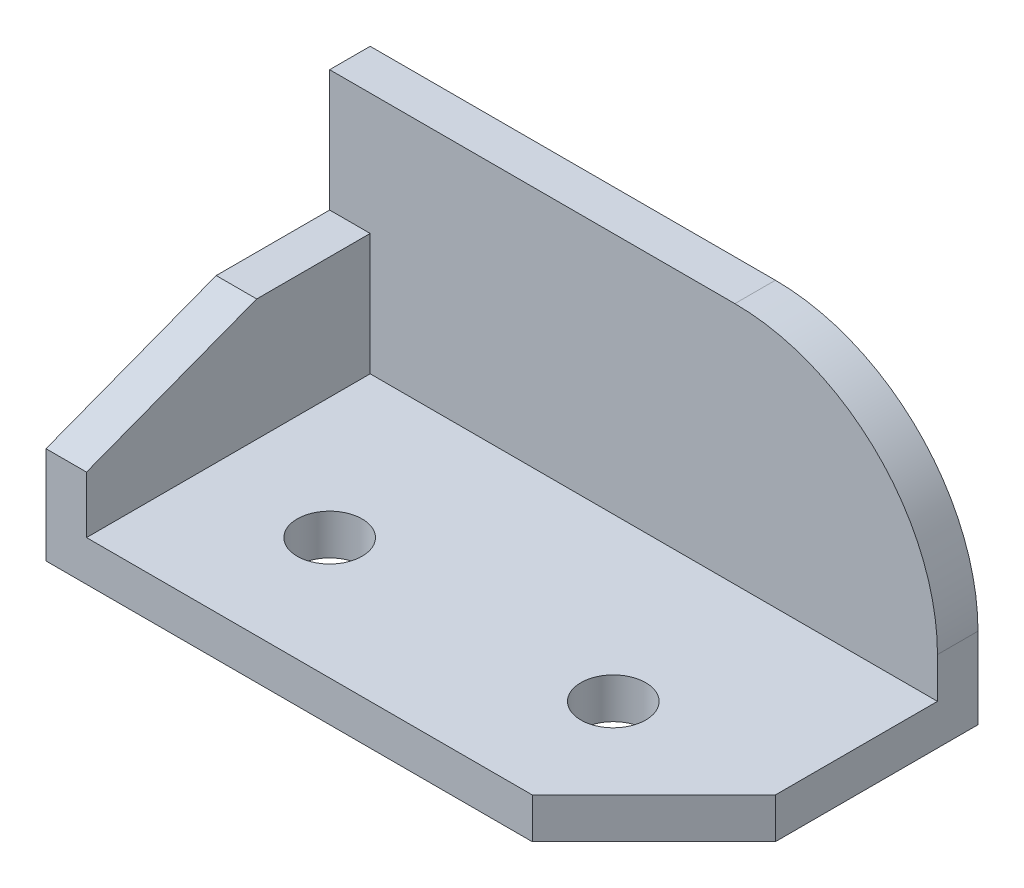
ISO-10303-21;
HEADER;
FILE_DESCRIPTION(('STEP AP214'),'2;1');
FILE_NAME('part.step','',(''),(''),'','','');
FILE_SCHEMA(('AUTOMOTIVE_DESIGN { 1 0 10303 214 1 1 1 1 }'));
ENDSEC;
DATA;
#1=APPLICATION_CONTEXT('core data for automotive mechanical design processes');
#2=APPLICATION_PROTOCOL_DEFINITION('international standard','automotive_design',2000,#1);
#3=PRODUCT_CONTEXT('',#1,'mechanical');
#4=PRODUCT('Part','Part','',(#3));
#5=PRODUCT_RELATED_PRODUCT_CATEGORY('part','',(#4));
#6=PRODUCT_DEFINITION_FORMATION('','',#4);
#7=PRODUCT_DEFINITION_CONTEXT('part definition',#1,'design');
#8=PRODUCT_DEFINITION('design','',#6,#7);
#9=PRODUCT_DEFINITION_SHAPE('','',#8);
#10=(LENGTH_UNIT() NAMED_UNIT(*) SI_UNIT(.MILLI.,.METRE.));
#11=(NAMED_UNIT(*) PLANE_ANGLE_UNIT() SI_UNIT($,.RADIAN.));
#12=(NAMED_UNIT(*) SI_UNIT($,.STERADIAN.) SOLID_ANGLE_UNIT());
#13=UNCERTAINTY_MEASURE_WITH_UNIT(LENGTH_MEASURE(1.E-05),#10,'distance_accuracy_value','');
#14=(GEOMETRIC_REPRESENTATION_CONTEXT(3) GLOBAL_UNCERTAINTY_ASSIGNED_CONTEXT((#13)) GLOBAL_UNIT_ASSIGNED_CONTEXT((#10,
#11,#12)) REPRESENTATION_CONTEXT('',''));
#15=CARTESIAN_POINT('',(0.,0.,0.));
#16=DIRECTION('',(0.,0.,1.));
#17=DIRECTION('',(1.,0.,0.));
#18=AXIS2_PLACEMENT_3D('',#15,#16,#17);
#19=CARTESIAN_POINT('',(5.,20.,0.));
#20=DIRECTION('',(0.,1.,0.));
#21=DIRECTION('',(0.,0.,1.));
#22=AXIS2_PLACEMENT_3D('',#19,#20,#21);
#23=PLANE('',#22);
#24=DIRECTION('',(0.,0.,-1.));
#25=VECTOR('',#24,1.);
#26=CARTESIAN_POINT('',(5.,20.,0.));
#27=LINE('',#26,#25);
#28=CARTESIAN_POINT('',(5.,20.,19.));
#29=VERTEX_POINT('',#28);
#30=CARTESIAN_POINT('',(5.,20.,5.));
#31=VERTEX_POINT('',#30);
#32=EDGE_CURVE('E172',#29,#31,#27,.T.);
#33=ORIENTED_EDGE('',*,*,#32,.T.);
#34=DIRECTION('',(1.,0.,0.));
#35=VECTOR('',#34,1.);
#36=CARTESIAN_POINT('',(0.,20.,5.));
#37=LINE('',#36,#35);
#38=CARTESIAN_POINT('',(0.,20.,5.));
#39=VERTEX_POINT('',#38);
#40=EDGE_CURVE('E59',#39,#31,#37,.T.);
#41=ORIENTED_EDGE('',*,*,#40,.F.);
#42=DIRECTION('',(0.,0.,-1.));
#43=VECTOR('',#42,1.);
#44=CARTESIAN_POINT('',(0.,20.,0.));
#45=LINE('',#44,#43);
#46=CARTESIAN_POINT('',(0.,20.,19.));
#47=VERTEX_POINT('',#46);
#48=EDGE_CURVE('E169',#47,#39,#45,.T.);
#49=ORIENTED_EDGE('',*,*,#48,.F.);
#50=DIRECTION('',(-1.,0.,0.));
#51=VECTOR('',#50,1.);
#52=CARTESIAN_POINT('',(5.,20.,19.));
#53=LINE('',#52,#51);
#54=EDGE_CURVE('E180',#29,#47,#53,.T.);
#55=ORIENTED_EDGE('',*,*,#54,.F.);
#56=EDGE_LOOP('',(#33,#41,#49,#55));
#57=FACE_BOUND('',#56,.T.);
#58=ADVANCED_FACE('F43',(#57),#23,.T.);
#59=CARTESIAN_POINT('',(5.,0.,0.));
#60=DIRECTION('',(1.,0.,0.));
#61=DIRECTION('',(0.,0.,-1.));
#62=AXIS2_PLACEMENT_3D('',#59,#60,#61);
#63=PLANE('',#62);
#64=DIRECTION('',(0.,0.,-1.));
#65=VECTOR('',#64,1.);
#66=CARTESIAN_POINT('',(5.,5.,0.));
#67=LINE('',#66,#65);
#68=CARTESIAN_POINT('',(5.,5.,40.));
#69=VERTEX_POINT('',#68);
#70=CARTESIAN_POINT('',(5.,5.,5.));
#71=VERTEX_POINT('',#70);
#72=EDGE_CURVE('E11',#69,#71,#67,.T.);
#73=ORIENTED_EDGE('',*,*,#72,.T.);
#74=DIRECTION('',(0.,-1.,0.));
#75=VECTOR('',#74,1.);
#76=CARTESIAN_POINT('',(5.,0.,5.));
#77=LINE('',#76,#75);
#78=EDGE_CURVE('E160',#31,#71,#77,.T.);
#79=ORIENTED_EDGE('',*,*,#78,.F.);
#80=ORIENTED_EDGE('',*,*,#32,.F.);
#81=DIRECTION('',(0.,0.355995327591988,-0.934487734928968));
#82=VECTOR('',#81,1.);
#83=CARTESIAN_POINT('',(5.,20.,19.));
#84=LINE('',#83,#82);
#85=CARTESIAN_POINT('',(5.00000000000001,12.,40.));
#86=VERTEX_POINT('',#85);
#87=EDGE_CURVE('E170',#86,#29,#84,.T.);
#88=ORIENTED_EDGE('',*,*,#87,.F.);
#89=DIRECTION('',(0.,1.,0.));
#90=VECTOR('',#89,1.);
#91=CARTESIAN_POINT('',(5.00000000000001,0.,40.));
#92=LINE('',#91,#90);
#93=EDGE_CURVE('E164',#69,#86,#92,.T.);
#94=ORIENTED_EDGE('',*,*,#93,.F.);
#95=EDGE_LOOP('',(#73,#79,#80,#88,#94));
#96=FACE_BOUND('',#95,.T.);
#97=ADVANCED_FACE('F258',(#96),#63,.T.);
#98=CARTESIAN_POINT('',(50.,5.,50.));
#99=DIRECTION('',(0.707106781186548,0.,0.707106781186548));
#100=DIRECTION('',(0.707106781186548,0.,-0.707106781186548));
#101=AXIS2_PLACEMENT_3D('',#98,#99,#100);
#102=PLANE('',#101);
#103=DIRECTION('',(-0.707106781186548,0.,0.707106781186548));
#104=VECTOR('',#103,1.);
#105=CARTESIAN_POINT('',(50.,0.,50.));
#106=LINE('',#105,#104);
#107=CARTESIAN_POINT('',(75.,0.,25.));
#108=VERTEX_POINT('',#107);
#109=CARTESIAN_POINT('',(60.,0.,40.));
#110=VERTEX_POINT('',#109);
#111=EDGE_CURVE('E204',#108,#110,#106,.T.);
#112=ORIENTED_EDGE('',*,*,#111,.F.);
#113=DIRECTION('',(0.,-1.,0.));
#114=VECTOR('',#113,1.);
#115=CARTESIAN_POINT('',(75.,5.,25.));
#116=LINE('',#115,#114);
#117=CARTESIAN_POINT('',(75.,5.,25.));
#118=VERTEX_POINT('',#117);
#119=EDGE_CURVE('E51',#118,#108,#116,.T.);
#120=ORIENTED_EDGE('',*,*,#119,.F.);
#121=DIRECTION('',(-0.707106781186548,0.,0.707106781186548));
#122=VECTOR('',#121,1.);
#123=CARTESIAN_POINT('',(50.,5.,50.));
#124=LINE('',#123,#122);
#125=CARTESIAN_POINT('',(60.,5.,40.));
#126=VERTEX_POINT('',#125);
#127=EDGE_CURVE('E193',#118,#126,#124,.T.);
#128=ORIENTED_EDGE('',*,*,#127,.T.);
#129=DIRECTION('',(0.,-1.,0.));
#130=VECTOR('',#129,1.);
#131=CARTESIAN_POINT('',(60.,5.,40.));
#132=LINE('',#131,#130);
#133=EDGE_CURVE('E196',#126,#110,#132,.T.);
#134=ORIENTED_EDGE('',*,*,#133,.T.);
#135=EDGE_LOOP('',(#112,#120,#128,#134));
#136=FACE_BOUND('',#135,.T.);
#137=ADVANCED_FACE('F232',(#136),#102,.T.);
#138=CARTESIAN_POINT('',(75.,5.,0.));
#139=DIRECTION('',(1.,0.,0.));
#140=DIRECTION('',(0.,0.,-1.));
#141=AXIS2_PLACEMENT_3D('',#138,#139,#140);
#142=PLANE('',#141);
#143=DIRECTION('',(0.,0.,1.));
#144=VECTOR('',#143,1.);
#145=CARTESIAN_POINT('',(75.,0.,0.));
#146=LINE('',#145,#144);
#147=CARTESIAN_POINT('',(75.,0.,0.));
#148=VERTEX_POINT('',#147);
#149=EDGE_CURVE('E210',#148,#108,#146,.T.);
#150=ORIENTED_EDGE('',*,*,#149,.F.);
#151=DIRECTION('',(0.,-1.,0.));
#152=VECTOR('',#151,1.);
#153=CARTESIAN_POINT('',(75.,5.,0.));
#154=LINE('',#153,#152);
#155=CARTESIAN_POINT('',(75.,9.99999999999999,0.));
#156=VERTEX_POINT('',#155);
#157=EDGE_CURVE('E224',#156,#148,#154,.T.);
#158=ORIENTED_EDGE('',*,*,#157,.F.);
#159=DIRECTION('',(0.,0.,-1.));
#160=VECTOR('',#159,1.);
#161=CARTESIAN_POINT('',(75.,9.99999999999999,5.));
#162=LINE('',#161,#160);
#163=CARTESIAN_POINT('',(75.,9.99999999999999,5.));
#164=VERTEX_POINT('',#163);
#165=EDGE_CURVE('E138',#164,#156,#162,.T.);
#166=ORIENTED_EDGE('',*,*,#165,.F.);
#167=DIRECTION('',(0.,-1.,0.));
#168=VECTOR('',#167,1.);
#169=CARTESIAN_POINT('',(75.,0.,5.));
#170=LINE('',#169,#168);
#171=CARTESIAN_POINT('',(75.,5.,5.));
#172=VERTEX_POINT('',#171);
#173=EDGE_CURVE('E144',#164,#172,#170,.T.);
#174=ORIENTED_EDGE('',*,*,#173,.T.);
#175=DIRECTION('',(0.,0.,1.));
#176=VECTOR('',#175,1.);
#177=CARTESIAN_POINT('',(75.,5.,0.));
#178=LINE('',#177,#176);
#179=EDGE_CURVE('E195',#172,#118,#178,.T.);
#180=ORIENTED_EDGE('',*,*,#179,.T.);
#181=ORIENTED_EDGE('',*,*,#119,.T.);
#182=EDGE_LOOP('',(#150,#158,#166,#174,#180,#181));
#183=FACE_BOUND('',#182,.T.);
#184=ADVANCED_FACE('F226',(#183),#142,.T.);
#185=CARTESIAN_POINT('',(0.,5.,0.));
#186=DIRECTION('',(0.,0.,-1.));
#187=DIRECTION('',(-1.,0.,0.));
#188=AXIS2_PLACEMENT_3D('',#185,#186,#187);
#189=PLANE('',#188);
#190=DIRECTION('',(0.,-1.,0.));
#191=VECTOR('',#190,1.);
#192=CARTESIAN_POINT('',(0.,5.,0.));
#193=LINE('',#192,#191);
#194=CARTESIAN_POINT('',(0.,35.,0.));
#195=VERTEX_POINT('',#194);
#196=CARTESIAN_POINT('',(0.,0.,0.));
#197=VERTEX_POINT('',#196);
#198=EDGE_CURVE('E222',#195,#197,#193,.T.);
#199=ORIENTED_EDGE('',*,*,#198,.F.);
#200=DIRECTION('',(1.,0.,0.));
#201=VECTOR('',#200,1.);
#202=CARTESIAN_POINT('',(0.,35.,0.));
#203=LINE('',#202,#201);
#204=CARTESIAN_POINT('',(50.,35.,0.));
#205=VERTEX_POINT('',#204);
#206=EDGE_CURVE('E151',#195,#205,#203,.T.);
#207=ORIENTED_EDGE('',*,*,#206,.T.);
#208=CARTESIAN_POINT('',(50.,9.99999999999999,0.));
#209=DIRECTION('',(0.,0.,-1.));
#210=DIRECTION('',(-1.,0.,0.));
#211=AXIS2_PLACEMENT_3D('',#208,#209,#210);
#212=CIRCLE('',#211,25.);
#213=EDGE_CURVE('E132',#205,#156,#212,.T.);
#214=ORIENTED_EDGE('',*,*,#213,.T.);
#215=ORIENTED_EDGE('',*,*,#157,.T.);
#216=DIRECTION('',(1.,0.,0.));
#217=VECTOR('',#216,1.);
#218=CARTESIAN_POINT('',(0.,0.,0.));
#219=LINE('',#218,#217);
#220=EDGE_CURVE('E209',#197,#148,#219,.T.);
#221=ORIENTED_EDGE('',*,*,#220,.F.);
#222=EDGE_LOOP('',(#199,#207,#214,#215,#221));
#223=FACE_BOUND('',#222,.T.);
#224=ADVANCED_FACE('F242',(#223),#189,.T.);
#225=CARTESIAN_POINT('',(0.,5.,0.));
#226=DIRECTION('',(1.,0.,0.));
#227=DIRECTION('',(0.,0.,-1.));
#228=AXIS2_PLACEMENT_3D('',#225,#226,#227);
#229=PLANE('',#228);
#230=DIRECTION('',(0.,0.,1.));
#231=VECTOR('',#230,1.);
#232=CARTESIAN_POINT('',(0.,0.,0.));
#233=LINE('',#232,#231);
#234=CARTESIAN_POINT('',(0.,0.,40.));
#235=VERTEX_POINT('',#234);
#236=EDGE_CURVE('E215',#197,#235,#233,.T.);
#237=ORIENTED_EDGE('',*,*,#236,.T.);
#238=DIRECTION('',(0.,-1.,0.));
#239=VECTOR('',#238,1.);
#240=CARTESIAN_POINT('',(0.,5.,40.));
#241=LINE('',#240,#239);
#242=CARTESIAN_POINT('',(0.,12.,40.));
#243=VERTEX_POINT('',#242);
#244=EDGE_CURVE('E217',#243,#235,#241,.T.);
#245=ORIENTED_EDGE('',*,*,#244,.F.);
#246=DIRECTION('',(0.,0.355995327591988,-0.934487734928968));
#247=VECTOR('',#246,1.);
#248=CARTESIAN_POINT('',(0.,20.,19.));
#249=LINE('',#248,#247);
#250=EDGE_CURVE('E162',#243,#47,#249,.T.);
#251=ORIENTED_EDGE('',*,*,#250,.T.);
#252=ORIENTED_EDGE('',*,*,#48,.T.);
#253=DIRECTION('',(0.,1.,0.));
#254=VECTOR('',#253,1.);
#255=CARTESIAN_POINT('',(0.,0.,5.));
#256=LINE('',#255,#254);
#257=CARTESIAN_POINT('',(0.,35.,5.));
#258=VERTEX_POINT('',#257);
#259=EDGE_CURVE('E139',#39,#258,#256,.T.);
#260=ORIENTED_EDGE('',*,*,#259,.T.);
#261=DIRECTION('',(0.,0.,-1.));
#262=VECTOR('',#261,1.);
#263=CARTESIAN_POINT('',(0.,35.,5.));
#264=LINE('',#263,#262);
#265=EDGE_CURVE('E149',#258,#195,#264,.T.);
#266=ORIENTED_EDGE('',*,*,#265,.T.);
#267=ORIENTED_EDGE('',*,*,#198,.T.);
#268=EDGE_LOOP('',(#237,#245,#251,#252,#260,#266,#267));
#269=FACE_BOUND('',#268,.T.);
#270=ADVANCED_FACE('F246',(#269),#229,.F.);
#271=CARTESIAN_POINT('',(55.,5.,25.));
#272=DIRECTION('',(0.,-1.,0.));
#273=DIRECTION('',(0.,0.,-1.));
#274=AXIS2_PLACEMENT_3D('',#271,#272,#273);
#275=CYLINDRICAL_SURFACE('',#274,4.);
#276=CARTESIAN_POINT('',(55.,5.,25.));
#277=DIRECTION('',(0.,1.,0.));
#278=DIRECTION('',(0.,0.,1.));
#279=AXIS2_PLACEMENT_3D('',#276,#277,#278);
#280=CIRCLE('',#279,4.);
#281=CARTESIAN_POINT('',(55.,5.,29.));
#282=VERTEX_POINT('',#281);
#283=EDGE_CURVE('E190',#282,#282,#280,.T.);
#284=ORIENTED_EDGE('',*,*,#283,.T.);
#285=EDGE_LOOP('',(#284));
#286=FACE_BOUND('',#285,.T.);
#287=CARTESIAN_POINT('',(55.,0.,25.));
#288=DIRECTION('',(0.,1.,0.));
#289=DIRECTION('',(0.,0.,1.));
#290=AXIS2_PLACEMENT_3D('',#287,#288,#289);
#291=CIRCLE('',#290,4.);
#292=CARTESIAN_POINT('',(55.,0.,29.));
#293=VERTEX_POINT('',#292);
#294=EDGE_CURVE('E203',#293,#293,#291,.T.);
#295=ORIENTED_EDGE('',*,*,#294,.F.);
#296=EDGE_LOOP('',(#295));
#297=FACE_BOUND('',#296,.T.);
#298=ADVANCED_FACE('F305',(#286,#297),#275,.F.);
#299=CARTESIAN_POINT('',(20.,5.,25.));
#300=DIRECTION('',(0.,-1.,0.));
#301=DIRECTION('',(0.,0.,-1.));
#302=AXIS2_PLACEMENT_3D('',#299,#300,#301);
#303=CYLINDRICAL_SURFACE('',#302,4.);
#304=CARTESIAN_POINT('',(20.,5.,25.));
#305=DIRECTION('',(0.,1.,0.));
#306=DIRECTION('',(0.,0.,1.));
#307=AXIS2_PLACEMENT_3D('',#304,#305,#306);
#308=CIRCLE('',#307,4.);
#309=CARTESIAN_POINT('',(20.,5.,29.));
#310=VERTEX_POINT('',#309);
#311=EDGE_CURVE('E184',#310,#310,#308,.T.);
#312=ORIENTED_EDGE('',*,*,#311,.T.);
#313=EDGE_LOOP('',(#312));
#314=FACE_BOUND('',#313,.T.);
#315=CARTESIAN_POINT('',(20.,0.,25.));
#316=DIRECTION('',(0.,1.,0.));
#317=DIRECTION('',(0.,0.,1.));
#318=AXIS2_PLACEMENT_3D('',#315,#316,#317);
#319=CIRCLE('',#318,4.);
#320=CARTESIAN_POINT('',(20.,0.,29.));
#321=VERTEX_POINT('',#320);
#322=EDGE_CURVE('E182',#321,#321,#319,.T.);
#323=ORIENTED_EDGE('',*,*,#322,.F.);
#324=EDGE_LOOP('',(#323));
#325=FACE_BOUND('',#324,.T.);
#326=ADVANCED_FACE('F44',(#314,#325),#303,.F.);
#327=CARTESIAN_POINT('',(0.,5.,40.));
#328=DIRECTION('',(0.,0.,-1.));
#329=DIRECTION('',(-1.,0.,0.));
#330=AXIS2_PLACEMENT_3D('',#327,#328,#329);
#331=PLANE('',#330);
#332=DIRECTION('',(1.,0.,0.));
#333=VECTOR('',#332,1.);
#334=CARTESIAN_POINT('',(0.,0.,40.));
#335=LINE('',#334,#333);
#336=EDGE_CURVE('E189',#235,#110,#335,.T.);
#337=ORIENTED_EDGE('',*,*,#336,.T.);
#338=ORIENTED_EDGE('',*,*,#133,.F.);
#339=DIRECTION('',(1.,0.,0.));
#340=VECTOR('',#339,1.);
#341=CARTESIAN_POINT('',(0.,5.,40.));
#342=LINE('',#341,#340);
#343=EDGE_CURVE('E198',#69,#126,#342,.T.);
#344=ORIENTED_EDGE('',*,*,#343,.F.);
#345=ORIENTED_EDGE('',*,*,#93,.T.);
#346=DIRECTION('',(-1.,0.,0.));
#347=VECTOR('',#346,1.);
#348=CARTESIAN_POINT('',(5.00000000000001,12.,40.));
#349=LINE('',#348,#347);
#350=EDGE_CURVE('E171',#86,#243,#349,.T.);
#351=ORIENTED_EDGE('',*,*,#350,.T.);
#352=ORIENTED_EDGE('',*,*,#244,.T.);
#353=EDGE_LOOP('',(#337,#338,#344,#345,#351,#352));
#354=FACE_BOUND('',#353,.T.);
#355=ADVANCED_FACE('F248',(#354),#331,.F.);
#356=CARTESIAN_POINT('',(0.,5.,0.));
#357=DIRECTION('',(0.,1.,0.));
#358=DIRECTION('',(0.,0.,1.));
#359=AXIS2_PLACEMENT_3D('',#356,#357,#358);
#360=PLANE('',#359);
#361=DIRECTION('',(1.,0.,0.));
#362=VECTOR('',#361,1.);
#363=CARTESIAN_POINT('',(0.,5.,5.));
#364=LINE('',#363,#362);
#365=EDGE_CURVE('E154',#71,#172,#364,.T.);
#366=ORIENTED_EDGE('',*,*,#365,.F.);
#367=ORIENTED_EDGE('',*,*,#72,.F.);
#368=ORIENTED_EDGE('',*,*,#343,.T.);
#369=ORIENTED_EDGE('',*,*,#127,.F.);
#370=ORIENTED_EDGE('',*,*,#179,.F.);
#371=EDGE_LOOP('',(#366,#367,#368,#369,#370));
#372=FACE_BOUND('',#371,.T.);
#373=ORIENTED_EDGE('',*,*,#311,.F.);
#374=EDGE_LOOP('',(#373));
#375=FACE_BOUND('',#374,.T.);
#376=ORIENTED_EDGE('',*,*,#283,.F.);
#377=EDGE_LOOP('',(#376));
#378=FACE_BOUND('',#377,.T.);
#379=ADVANCED_FACE('F245',(#372,#375,#378),#360,.T.);
#380=CARTESIAN_POINT('',(0.,0.,0.));
#381=DIRECTION('',(0.,1.,0.));
#382=DIRECTION('',(0.,0.,1.));
#383=AXIS2_PLACEMENT_3D('',#380,#381,#382);
#384=PLANE('',#383);
#385=ORIENTED_EDGE('',*,*,#220,.T.);
#386=ORIENTED_EDGE('',*,*,#149,.T.);
#387=ORIENTED_EDGE('',*,*,#111,.T.);
#388=ORIENTED_EDGE('',*,*,#336,.F.);
#389=ORIENTED_EDGE('',*,*,#236,.F.);
#390=EDGE_LOOP('',(#385,#386,#387,#388,#389));
#391=FACE_BOUND('',#390,.T.);
#392=ORIENTED_EDGE('',*,*,#294,.T.);
#393=EDGE_LOOP('',(#392));
#394=FACE_BOUND('',#393,.T.);
#395=ORIENTED_EDGE('',*,*,#322,.T.);
#396=EDGE_LOOP('',(#395));
#397=FACE_BOUND('',#396,.T.);
#398=ADVANCED_FACE('F237',(#391,#394,#397),#384,.F.);
#399=CARTESIAN_POINT('',(5.,20.,19.));
#400=DIRECTION('',(0.,0.934487734928968,0.355995327591988));
#401=DIRECTION('',(0.,-0.355995327591988,0.934487734928968));
#402=AXIS2_PLACEMENT_3D('',#399,#400,#401);
#403=PLANE('',#402);
#404=ORIENTED_EDGE('',*,*,#250,.F.);
#405=ORIENTED_EDGE('',*,*,#350,.F.);
#406=ORIENTED_EDGE('',*,*,#87,.T.);
#407=ORIENTED_EDGE('',*,*,#54,.T.);
#408=EDGE_LOOP('',(#404,#405,#406,#407));
#409=FACE_BOUND('',#408,.T.);
#410=ADVANCED_FACE('F256',(#409),#403,.T.);
#411=CARTESIAN_POINT('',(0.,35.,5.));
#412=DIRECTION('',(0.,1.,0.));
#413=DIRECTION('',(0.,0.,1.));
#414=AXIS2_PLACEMENT_3D('',#411,#412,#413);
#415=PLANE('',#414);
#416=ORIENTED_EDGE('',*,*,#206,.F.);
#417=ORIENTED_EDGE('',*,*,#265,.F.);
#418=DIRECTION('',(1.,0.,0.));
#419=VECTOR('',#418,1.);
#420=CARTESIAN_POINT('',(0.,35.,5.));
#421=LINE('',#420,#419);
#422=CARTESIAN_POINT('',(50.,35.,5.));
#423=VERTEX_POINT('',#422);
#424=EDGE_CURVE('E142',#258,#423,#421,.T.);
#425=ORIENTED_EDGE('',*,*,#424,.T.);
#426=DIRECTION('',(0.,0.,-1.));
#427=VECTOR('',#426,1.);
#428=CARTESIAN_POINT('',(50.,35.,5.));
#429=LINE('',#428,#427);
#430=EDGE_CURVE('E121',#423,#205,#429,.T.);
#431=ORIENTED_EDGE('',*,*,#430,.T.);
#432=EDGE_LOOP('',(#416,#417,#425,#431));
#433=FACE_BOUND('',#432,.T.);
#434=ADVANCED_FACE('F150',(#433),#415,.T.);
#435=CARTESIAN_POINT('',(50.,9.99999999999999,5.));
#436=DIRECTION('',(0.,0.,-1.));
#437=DIRECTION('',(-1.,0.,0.));
#438=AXIS2_PLACEMENT_3D('',#435,#436,#437);
#439=CYLINDRICAL_SURFACE('',#438,25.);
#440=ORIENTED_EDGE('',*,*,#213,.F.);
#441=ORIENTED_EDGE('',*,*,#430,.F.);
#442=CARTESIAN_POINT('',(50.,9.99999999999999,5.));
#443=DIRECTION('',(0.,0.,-1.));
#444=DIRECTION('',(-1.,0.,0.));
#445=AXIS2_PLACEMENT_3D('',#442,#443,#444);
#446=CIRCLE('',#445,25.);
#447=EDGE_CURVE('E129',#423,#164,#446,.T.);
#448=ORIENTED_EDGE('',*,*,#447,.T.);
#449=ORIENTED_EDGE('',*,*,#165,.T.);
#450=EDGE_LOOP('',(#440,#441,#448,#449));
#451=FACE_BOUND('',#450,.T.);
#452=ADVANCED_FACE('F130',(#451),#439,.T.);
#453=CARTESIAN_POINT('',(0.,0.,5.));
#454=DIRECTION('',(0.,0.,-1.));
#455=DIRECTION('',(-1.,0.,0.));
#456=AXIS2_PLACEMENT_3D('',#453,#454,#455);
#457=PLANE('',#456);
#458=ORIENTED_EDGE('',*,*,#424,.F.);
#459=ORIENTED_EDGE('',*,*,#259,.F.);
#460=ORIENTED_EDGE('',*,*,#40,.T.);
#461=ORIENTED_EDGE('',*,*,#78,.T.);
#462=ORIENTED_EDGE('',*,*,#365,.T.);
#463=ORIENTED_EDGE('',*,*,#173,.F.);
#464=ORIENTED_EDGE('',*,*,#447,.F.);
#465=EDGE_LOOP('',(#458,#459,#460,#461,#462,#463,#464));
#466=FACE_BOUND('',#465,.T.);
#467=ADVANCED_FACE('F143',(#466),#457,.F.);
#468=CLOSED_SHELL('',(#58,#97,#137,#184,#224,#270,#298,#326,#355,#379,#398,#410,#434,#452,#467));
#469=MANIFOLD_SOLID_BREP('B2',#468);
#470=ADVANCED_BREP_SHAPE_REPRESENTATION('',(#18,#469),#14);
#471=SHAPE_DEFINITION_REPRESENTATION(#9,#470);
ENDSEC;
END-ISO-10303-21;
